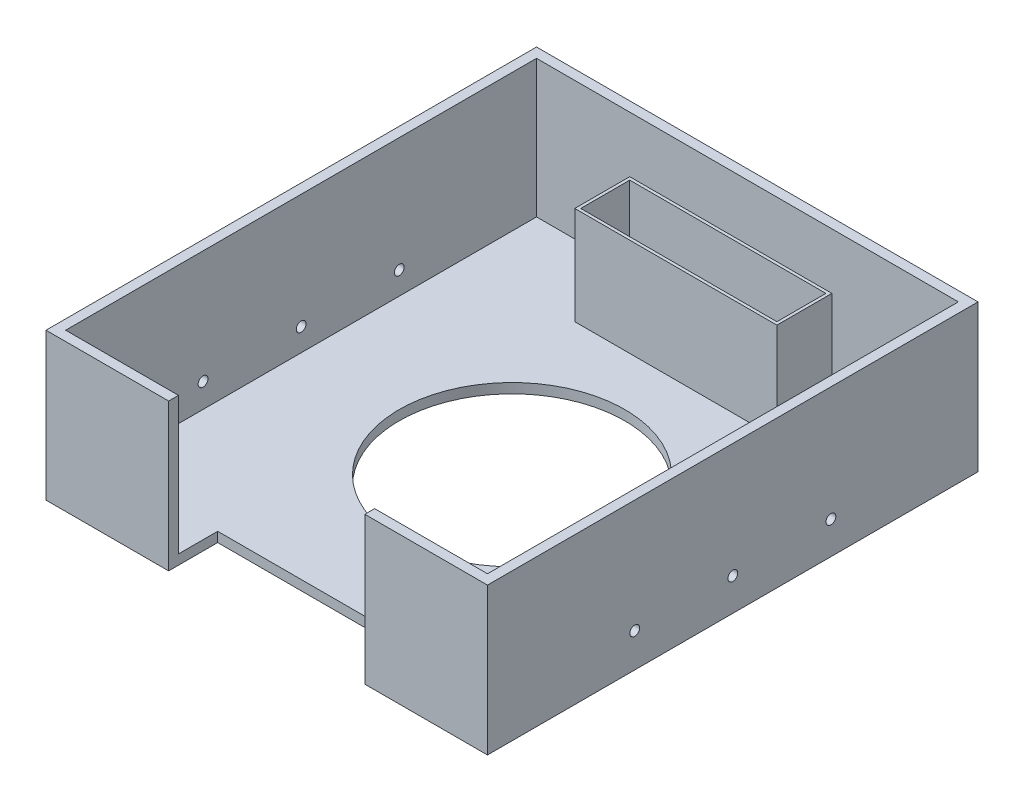
ISO-10303-21;
HEADER;
FILE_DESCRIPTION(('STEP AP214'),'2;1');
FILE_NAME('part.step','',(''),(''),'','','');
FILE_SCHEMA(('AUTOMOTIVE_DESIGN { 1 0 10303 214 1 1 1 1 }'));
ENDSEC;
DATA;
#1=APPLICATION_CONTEXT('core data for automotive mechanical design processes');
#2=APPLICATION_PROTOCOL_DEFINITION('international standard','automotive_design',2000,#1);
#3=PRODUCT_CONTEXT('',#1,'mechanical');
#4=PRODUCT('Part','Part','',(#3));
#5=PRODUCT_RELATED_PRODUCT_CATEGORY('part','',(#4));
#6=PRODUCT_DEFINITION_FORMATION('','',#4);
#7=PRODUCT_DEFINITION_CONTEXT('part definition',#1,'design');
#8=PRODUCT_DEFINITION('design','',#6,#7);
#9=PRODUCT_DEFINITION_SHAPE('','',#8);
#10=(LENGTH_UNIT() NAMED_UNIT(*) SI_UNIT(.MILLI.,.METRE.));
#11=(NAMED_UNIT(*) PLANE_ANGLE_UNIT() SI_UNIT($,.RADIAN.));
#12=(NAMED_UNIT(*) SI_UNIT($,.STERADIAN.) SOLID_ANGLE_UNIT());
#13=UNCERTAINTY_MEASURE_WITH_UNIT(LENGTH_MEASURE(1.E-05),#10,'distance_accuracy_value','');
#14=(GEOMETRIC_REPRESENTATION_CONTEXT(3) GLOBAL_UNCERTAINTY_ASSIGNED_CONTEXT((#13)) GLOBAL_UNIT_ASSIGNED_CONTEXT((#10,
#11,#12)) REPRESENTATION_CONTEXT('',''));
#15=CARTESIAN_POINT('',(0.,0.,0.));
#16=DIRECTION('',(0.,0.,1.));
#17=DIRECTION('',(1.,0.,0.));
#18=AXIS2_PLACEMENT_3D('',#15,#16,#17);
#19=CARTESIAN_POINT('',(0.,10.,0.));
#20=DIRECTION('',(0.,-1.,0.));
#21=DIRECTION('',(0.,0.,-1.));
#22=AXIS2_PLACEMENT_3D('',#19,#20,#21);
#23=PLANE('',#22);
#24=CARTESIAN_POINT('',(0.,10.,0.));
#25=DIRECTION('',(0.,1.,0.));
#26=DIRECTION('',(0.,0.,1.));
#27=AXIS2_PLACEMENT_3D('',#24,#25,#26);
#28=CIRCLE('',#27,115.);
#29=CARTESIAN_POINT('',(0.,10.,115.));
#30=VERTEX_POINT('',#29);
#31=EDGE_CURVE('E316',#30,#30,#28,.T.);
#32=ORIENTED_EDGE('',*,*,#31,.F.);
#33=EDGE_LOOP('',(#32));
#34=FACE_BOUND('',#33,.T.);
#35=DIRECTION('',(1.,0.,0.));
#36=VECTOR('',#35,1.);
#37=CARTESIAN_POINT('',(0.,10.,200.));
#38=LINE('',#37,#36);
#39=CARTESIAN_POINT('',(-100.,10.,200.));
#40=VERTEX_POINT('',#39);
#41=CARTESIAN_POINT('',(100.,10.,200.));
#42=VERTEX_POINT('',#41);
#43=EDGE_CURVE('E391',#40,#42,#38,.T.);
#44=ORIENTED_EDGE('',*,*,#43,.T.);
#45=DIRECTION('',(0.,0.,1.));
#46=VECTOR('',#45,1.);
#47=CARTESIAN_POINT('',(100.,10.,0.));
#48=LINE('',#47,#46);
#49=CARTESIAN_POINT('',(100.,10.,240.));
#50=VERTEX_POINT('',#49);
#51=EDGE_CURVE('E11',#42,#50,#48,.T.);
#52=ORIENTED_EDGE('',*,*,#51,.T.);
#53=DIRECTION('',(1.,0.,0.));
#54=VECTOR('',#53,1.);
#55=CARTESIAN_POINT('',(-215.,10.,240.));
#56=LINE('',#55,#54);
#57=CARTESIAN_POINT('',(215.,10.,240.));
#58=VERTEX_POINT('',#57);
#59=EDGE_CURVE('E320',#50,#58,#56,.T.);
#60=ORIENTED_EDGE('',*,*,#59,.T.);
#61=DIRECTION('',(0.,0.,-1.));
#62=VECTOR('',#61,1.);
#63=CARTESIAN_POINT('',(215.,10.,240.));
#64=LINE('',#63,#62);
#65=CARTESIAN_POINT('',(215.,10.,-240.));
#66=VERTEX_POINT('',#65);
#67=EDGE_CURVE('E338',#58,#66,#64,.T.);
#68=ORIENTED_EDGE('',*,*,#67,.T.);
#69=DIRECTION('',(-1.,0.,0.));
#70=VECTOR('',#69,1.);
#71=CARTESIAN_POINT('',(215.,10.,-240.));
#72=LINE('',#71,#70);
#73=CARTESIAN_POINT('',(-215.,10.,-240.));
#74=VERTEX_POINT('',#73);
#75=EDGE_CURVE('E341',#66,#74,#72,.T.);
#76=ORIENTED_EDGE('',*,*,#75,.T.);
#77=DIRECTION('',(0.,0.,1.));
#78=VECTOR('',#77,1.);
#79=CARTESIAN_POINT('',(-215.,10.,-240.));
#80=LINE('',#79,#78);
#81=CARTESIAN_POINT('',(-215.,10.,240.));
#82=VERTEX_POINT('',#81);
#83=EDGE_CURVE('E344',#74,#82,#80,.T.);
#84=ORIENTED_EDGE('',*,*,#83,.T.);
#85=CARTESIAN_POINT('',(-100.,10.,240.));
#86=VERTEX_POINT('',#85);
#87=EDGE_CURVE('E335',#82,#86,#56,.T.);
#88=ORIENTED_EDGE('',*,*,#87,.T.);
#89=DIRECTION('',(0.,0.,-1.));
#90=VECTOR('',#89,1.);
#91=CARTESIAN_POINT('',(-100.,10.,0.));
#92=LINE('',#91,#90);
#93=EDGE_CURVE('E43',#86,#40,#92,.T.);
#94=ORIENTED_EDGE('',*,*,#93,.T.);
#95=EDGE_LOOP('',(#44,#52,#60,#68,#76,#84,#88,#94));
#96=FACE_BOUND('',#95,.T.);
#97=DIRECTION('',(0.,0.,1.));
#98=VECTOR('',#97,1.);
#99=CARTESIAN_POINT('',(-103.,10.,-223.));
#100=LINE('',#99,#98);
#101=CARTESIAN_POINT('',(-103.,10.,-223.));
#102=VERTEX_POINT('',#101);
#103=CARTESIAN_POINT('',(-103.,10.,-167.));
#104=VERTEX_POINT('',#103);
#105=EDGE_CURVE('E201',#102,#104,#100,.T.);
#106=ORIENTED_EDGE('',*,*,#105,.F.);
#107=DIRECTION('',(-1.,0.,0.));
#108=VECTOR('',#107,1.);
#109=CARTESIAN_POINT('',(-103.,10.,-223.));
#110=LINE('',#109,#108);
#111=CARTESIAN_POINT('',(103.,10.,-223.));
#112=VERTEX_POINT('',#111);
#113=EDGE_CURVE('E229',#112,#102,#110,.T.);
#114=ORIENTED_EDGE('',*,*,#113,.F.);
#115=DIRECTION('',(0.,0.,-1.));
#116=VECTOR('',#115,1.);
#117=CARTESIAN_POINT('',(103.,10.,-223.));
#118=LINE('',#117,#116);
#119=CARTESIAN_POINT('',(103.,10.,-167.));
#120=VERTEX_POINT('',#119);
#121=EDGE_CURVE('E55',#120,#112,#118,.T.);
#122=ORIENTED_EDGE('',*,*,#121,.F.);
#123=DIRECTION('',(1.,0.,0.));
#124=VECTOR('',#123,1.);
#125=CARTESIAN_POINT('',(-103.,10.,-167.));
#126=LINE('',#125,#124);
#127=EDGE_CURVE('E50',#104,#120,#126,.T.);
#128=ORIENTED_EDGE('',*,*,#127,.F.);
#129=EDGE_LOOP('',(#106,#114,#122,#128));
#130=FACE_BOUND('',#129,.T.);
#131=ADVANCED_FACE('F35',(#34,#96,#130),#23,.F.);
#132=CARTESIAN_POINT('',(-225.,10.,250.));
#133=DIRECTION('',(0.,0.,-1.));
#134=DIRECTION('',(-1.,0.,0.));
#135=AXIS2_PLACEMENT_3D('',#132,#133,#134);
#136=PLANE('',#135);
#137=DIRECTION('',(1.,0.,0.));
#138=VECTOR('',#137,1.);
#139=CARTESIAN_POINT('',(-225.,150.,250.));
#140=LINE('',#139,#138);
#141=CARTESIAN_POINT('',(100.,150.,250.));
#142=VERTEX_POINT('',#141);
#143=CARTESIAN_POINT('',(225.,150.,250.));
#144=VERTEX_POINT('',#143);
#145=EDGE_CURVE('E355',#142,#144,#140,.T.);
#146=ORIENTED_EDGE('',*,*,#145,.F.);
#147=DIRECTION('',(0.,-1.,0.));
#148=VECTOR('',#147,1.);
#149=CARTESIAN_POINT('',(99.9999999999999,10.,250.));
#150=LINE('',#149,#148);
#151=CARTESIAN_POINT('',(100.,0.,250.));
#152=VERTEX_POINT('',#151);
#153=EDGE_CURVE('E313',#142,#152,#150,.T.);
#154=ORIENTED_EDGE('',*,*,#153,.T.);
#155=DIRECTION('',(1.,0.,0.));
#156=VECTOR('',#155,1.);
#157=CARTESIAN_POINT('',(-225.,0.,250.));
#158=LINE('',#157,#156);
#159=CARTESIAN_POINT('',(225.,0.,250.));
#160=VERTEX_POINT('',#159);
#161=EDGE_CURVE('E375',#152,#160,#158,.T.);
#162=ORIENTED_EDGE('',*,*,#161,.T.);
#163=DIRECTION('',(0.,-1.,0.));
#164=VECTOR('',#163,1.);
#165=CARTESIAN_POINT('',(225.,10.,250.));
#166=LINE('',#165,#164);
#167=EDGE_CURVE('E379',#144,#160,#166,.T.);
#168=ORIENTED_EDGE('',*,*,#167,.F.);
#169=EDGE_LOOP('',(#146,#154,#162,#168));
#170=FACE_BOUND('',#169,.T.);
#171=ADVANCED_FACE('F455',(#170),#136,.F.);
#172=CARTESIAN_POINT('',(-215.,150.,240.));
#173=DIRECTION('',(0.,0.,-1.));
#174=DIRECTION('',(-1.,0.,0.));
#175=AXIS2_PLACEMENT_3D('',#172,#173,#174);
#176=PLANE('',#175);
#177=DIRECTION('',(0.,-1.,0.));
#178=VECTOR('',#177,1.);
#179=CARTESIAN_POINT('',(99.9999999999999,150.,240.));
#180=LINE('',#179,#178);
#181=CARTESIAN_POINT('',(100.,150.,240.));
#182=VERTEX_POINT('',#181);
#183=EDGE_CURVE('E311',#182,#50,#180,.T.);
#184=ORIENTED_EDGE('',*,*,#183,.F.);
#185=DIRECTION('',(1.,0.,0.));
#186=VECTOR('',#185,1.);
#187=CARTESIAN_POINT('',(-215.,150.,240.));
#188=LINE('',#187,#186);
#189=CARTESIAN_POINT('',(215.,150.,240.));
#190=VERTEX_POINT('',#189);
#191=EDGE_CURVE('E327',#182,#190,#188,.T.);
#192=ORIENTED_EDGE('',*,*,#191,.T.);
#193=DIRECTION('',(0.,-1.,0.));
#194=VECTOR('',#193,1.);
#195=CARTESIAN_POINT('',(215.,150.,240.));
#196=LINE('',#195,#194);
#197=EDGE_CURVE('E352',#190,#58,#196,.T.);
#198=ORIENTED_EDGE('',*,*,#197,.T.);
#199=ORIENTED_EDGE('',*,*,#59,.F.);
#200=EDGE_LOOP('',(#184,#192,#198,#199));
#201=FACE_BOUND('',#200,.T.);
#202=ADVANCED_FACE('F429',(#201),#176,.T.);
#203=CARTESIAN_POINT('',(225.,10.,250.));
#204=DIRECTION('',(-1.,0.,0.));
#205=DIRECTION('',(0.,0.,1.));
#206=AXIS2_PLACEMENT_3D('',#203,#204,#205);
#207=PLANE('',#206);
#208=CARTESIAN_POINT('',(225.,34.7,99.9));
#209=DIRECTION('',(1.,0.,0.));
#210=DIRECTION('',(0.,0.,-1.));
#211=AXIS2_PLACEMENT_3D('',#208,#209,#210);
#212=CIRCLE('',#211,5.00000000000001);
#213=CARTESIAN_POINT('',(225.,34.7,94.9));
#214=VERTEX_POINT('',#213);
#215=EDGE_CURVE('E275',#214,#214,#212,.T.);
#216=ORIENTED_EDGE('',*,*,#215,.F.);
#217=EDGE_LOOP('',(#216));
#218=FACE_BOUND('',#217,.T.);
#219=CARTESIAN_POINT('',(225.,33.13,-0.100000000000017));
#220=DIRECTION('',(1.,0.,0.));
#221=DIRECTION('',(0.,0.,-1.));
#222=AXIS2_PLACEMENT_3D('',#219,#220,#221);
#223=CIRCLE('',#222,5.);
#224=CARTESIAN_POINT('',(225.,33.13,-5.10000000000002));
#225=VERTEX_POINT('',#224);
#226=EDGE_CURVE('E281',#225,#225,#223,.T.);
#227=ORIENTED_EDGE('',*,*,#226,.F.);
#228=EDGE_LOOP('',(#227));
#229=FACE_BOUND('',#228,.T.);
#230=CARTESIAN_POINT('',(225.,33.13,-100.1));
#231=DIRECTION('',(1.,0.,0.));
#232=DIRECTION('',(0.,0.,-1.));
#233=AXIS2_PLACEMENT_3D('',#230,#231,#232);
#234=CIRCLE('',#233,5.00000000000001);
#235=CARTESIAN_POINT('',(225.,33.13,-105.1));
#236=VERTEX_POINT('',#235);
#237=EDGE_CURVE('E268',#236,#236,#234,.T.);
#238=ORIENTED_EDGE('',*,*,#237,.F.);
#239=EDGE_LOOP('',(#238));
#240=FACE_BOUND('',#239,.T.);
#241=DIRECTION('',(0.,0.,-1.));
#242=VECTOR('',#241,1.);
#243=CARTESIAN_POINT('',(225.,0.,250.));
#244=LINE('',#243,#242);
#245=CARTESIAN_POINT('',(225.,0.,-250.));
#246=VERTEX_POINT('',#245);
#247=EDGE_CURVE('E368',#160,#246,#244,.T.);
#248=ORIENTED_EDGE('',*,*,#247,.T.);
#249=DIRECTION('',(0.,-1.,0.));
#250=VECTOR('',#249,1.);
#251=CARTESIAN_POINT('',(225.,10.,-250.));
#252=LINE('',#251,#250);
#253=CARTESIAN_POINT('',(225.,150.,-250.));
#254=VERTEX_POINT('',#253);
#255=EDGE_CURVE('E388',#254,#246,#252,.T.);
#256=ORIENTED_EDGE('',*,*,#255,.F.);
#257=DIRECTION('',(0.,0.,-1.));
#258=VECTOR('',#257,1.);
#259=CARTESIAN_POINT('',(225.,150.,250.));
#260=LINE('',#259,#258);
#261=EDGE_CURVE('E359',#144,#254,#260,.T.);
#262=ORIENTED_EDGE('',*,*,#261,.F.);
#263=ORIENTED_EDGE('',*,*,#167,.T.);
#264=EDGE_LOOP('',(#248,#256,#262,#263));
#265=FACE_BOUND('',#264,.T.);
#266=ADVANCED_FACE('F37',(#218,#229,#240,#265),#207,.F.);
#267=CARTESIAN_POINT('',(-225.,10.,-250.));
#268=DIRECTION('',(0.,0.,1.));
#269=DIRECTION('',(1.,0.,0.));
#270=AXIS2_PLACEMENT_3D('',#267,#268,#269);
#271=PLANE('',#270);
#272=DIRECTION('',(-1.,0.,0.));
#273=VECTOR('',#272,1.);
#274=CARTESIAN_POINT('',(-225.,0.,-250.));
#275=LINE('',#274,#273);
#276=CARTESIAN_POINT('',(-225.,0.,-250.));
#277=VERTEX_POINT('',#276);
#278=EDGE_CURVE('E371',#246,#277,#275,.T.);
#279=ORIENTED_EDGE('',*,*,#278,.T.);
#280=DIRECTION('',(0.,-1.,0.));
#281=VECTOR('',#280,1.);
#282=CARTESIAN_POINT('',(-225.,10.,-250.));
#283=LINE('',#282,#281);
#284=CARTESIAN_POINT('',(-225.,150.,-250.));
#285=VERTEX_POINT('',#284);
#286=EDGE_CURVE('E385',#285,#277,#283,.T.);
#287=ORIENTED_EDGE('',*,*,#286,.F.);
#288=DIRECTION('',(-1.,0.,0.));
#289=VECTOR('',#288,1.);
#290=CARTESIAN_POINT('',(225.,150.,-250.));
#291=LINE('',#290,#289);
#292=EDGE_CURVE('E362',#254,#285,#291,.T.);
#293=ORIENTED_EDGE('',*,*,#292,.F.);
#294=ORIENTED_EDGE('',*,*,#255,.T.);
#295=EDGE_LOOP('',(#279,#287,#293,#294));
#296=FACE_BOUND('',#295,.T.);
#297=ADVANCED_FACE('F641',(#296),#271,.F.);
#298=CARTESIAN_POINT('',(-225.,10.,250.));
#299=DIRECTION('',(1.,0.,0.));
#300=DIRECTION('',(0.,0.,-1.));
#301=AXIS2_PLACEMENT_3D('',#298,#299,#300);
#302=PLANE('',#301);
#303=CARTESIAN_POINT('',(-225.,33.13,-100.1));
#304=DIRECTION('',(-1.,0.,0.));
#305=DIRECTION('',(0.,0.,1.));
#306=AXIS2_PLACEMENT_3D('',#303,#304,#305);
#307=CIRCLE('',#306,5.00000000000001);
#308=CARTESIAN_POINT('',(-225.,33.13,-95.1));
#309=VERTEX_POINT('',#308);
#310=EDGE_CURVE('E252',#309,#309,#307,.T.);
#311=ORIENTED_EDGE('',*,*,#310,.F.);
#312=EDGE_LOOP('',(#311));
#313=FACE_BOUND('',#312,.T.);
#314=CARTESIAN_POINT('',(-225.,34.7,99.9));
#315=DIRECTION('',(-1.,0.,0.));
#316=DIRECTION('',(0.,0.,1.));
#317=AXIS2_PLACEMENT_3D('',#314,#315,#316);
#318=CIRCLE('',#317,5.00000000000001);
#319=CARTESIAN_POINT('',(-225.,34.7,104.9));
#320=VERTEX_POINT('',#319);
#321=EDGE_CURVE('E257',#320,#320,#318,.T.);
#322=ORIENTED_EDGE('',*,*,#321,.F.);
#323=EDGE_LOOP('',(#322));
#324=FACE_BOUND('',#323,.T.);
#325=CARTESIAN_POINT('',(-225.,33.13,-0.100000000000017));
#326=DIRECTION('',(-1.,0.,0.));
#327=DIRECTION('',(0.,0.,1.));
#328=AXIS2_PLACEMENT_3D('',#325,#326,#327);
#329=CIRCLE('',#328,5.00000000000001);
#330=CARTESIAN_POINT('',(-225.,33.13,4.89999999999999));
#331=VERTEX_POINT('',#330);
#332=EDGE_CURVE('E256',#331,#331,#329,.T.);
#333=ORIENTED_EDGE('',*,*,#332,.F.);
#334=EDGE_LOOP('',(#333));
#335=FACE_BOUND('',#334,.T.);
#336=DIRECTION('',(0.,0.,1.));
#337=VECTOR('',#336,1.);
#338=CARTESIAN_POINT('',(-225.,0.,250.));
#339=LINE('',#338,#337);
#340=CARTESIAN_POINT('',(-225.,0.,250.));
#341=VERTEX_POINT('',#340);
#342=EDGE_CURVE('E373',#277,#341,#339,.T.);
#343=ORIENTED_EDGE('',*,*,#342,.T.);
#344=DIRECTION('',(0.,-1.,0.));
#345=VECTOR('',#344,1.);
#346=CARTESIAN_POINT('',(-225.,10.,250.));
#347=LINE('',#346,#345);
#348=CARTESIAN_POINT('',(-225.,150.,250.));
#349=VERTEX_POINT('',#348);
#350=EDGE_CURVE('E382',#349,#341,#347,.T.);
#351=ORIENTED_EDGE('',*,*,#350,.F.);
#352=DIRECTION('',(0.,0.,1.));
#353=VECTOR('',#352,1.);
#354=CARTESIAN_POINT('',(-225.,150.,-250.));
#355=LINE('',#354,#353);
#356=EDGE_CURVE('E365',#285,#349,#355,.T.);
#357=ORIENTED_EDGE('',*,*,#356,.F.);
#358=ORIENTED_EDGE('',*,*,#286,.T.);
#359=EDGE_LOOP('',(#343,#351,#357,#358));
#360=FACE_BOUND('',#359,.T.);
#361=ADVANCED_FACE('F652',(#313,#324,#335,#360),#302,.F.);
#362=CARTESIAN_POINT('',(-100.,0.,250.));
#363=VERTEX_POINT('',#362);
#364=EDGE_CURVE('E376',#341,#363,#158,.T.);
#365=ORIENTED_EDGE('',*,*,#364,.T.);
#366=DIRECTION('',(0.,1.,0.));
#367=VECTOR('',#366,1.);
#368=CARTESIAN_POINT('',(-100.,10.,250.));
#369=LINE('',#368,#367);
#370=CARTESIAN_POINT('',(-100.,150.,250.));
#371=VERTEX_POINT('',#370);
#372=EDGE_CURVE('E308',#363,#371,#369,.T.);
#373=ORIENTED_EDGE('',*,*,#372,.T.);
#374=EDGE_CURVE('E356',#349,#371,#140,.T.);
#375=ORIENTED_EDGE('',*,*,#374,.F.);
#376=ORIENTED_EDGE('',*,*,#350,.T.);
#377=EDGE_LOOP('',(#365,#373,#375,#376));
#378=FACE_BOUND('',#377,.T.);
#379=ADVANCED_FACE('F412',(#378),#136,.F.);
#380=CARTESIAN_POINT('',(0.,0.,0.));
#381=DIRECTION('',(0.,-1.,0.));
#382=DIRECTION('',(0.,0.,-1.));
#383=AXIS2_PLACEMENT_3D('',#380,#381,#382);
#384=PLANE('',#383);
#385=DIRECTION('',(0.,0.,-1.));
#386=VECTOR('',#385,1.);
#387=CARTESIAN_POINT('',(100.,0.,300.));
#388=LINE('',#387,#386);
#389=CARTESIAN_POINT('',(100.,0.,200.));
#390=VERTEX_POINT('',#389);
#391=EDGE_CURVE('E289',#152,#390,#388,.T.);
#392=ORIENTED_EDGE('',*,*,#391,.T.);
#393=DIRECTION('',(-1.,0.,0.));
#394=VECTOR('',#393,1.);
#395=CARTESIAN_POINT('',(-100.,0.,200.));
#396=LINE('',#395,#394);
#397=CARTESIAN_POINT('',(-100.,0.,200.));
#398=VERTEX_POINT('',#397);
#399=EDGE_CURVE('E292',#390,#398,#396,.T.);
#400=ORIENTED_EDGE('',*,*,#399,.T.);
#401=DIRECTION('',(0.,0.,1.));
#402=VECTOR('',#401,1.);
#403=CARTESIAN_POINT('',(-100.,0.,300.));
#404=LINE('',#403,#402);
#405=EDGE_CURVE('E296',#398,#363,#404,.T.);
#406=ORIENTED_EDGE('',*,*,#405,.T.);
#407=ORIENTED_EDGE('',*,*,#364,.F.);
#408=ORIENTED_EDGE('',*,*,#342,.F.);
#409=ORIENTED_EDGE('',*,*,#278,.F.);
#410=ORIENTED_EDGE('',*,*,#247,.F.);
#411=ORIENTED_EDGE('',*,*,#161,.F.);
#412=EDGE_LOOP('',(#392,#400,#406,#407,#408,#409,#410,#411));
#413=FACE_BOUND('',#412,.T.);
#414=CARTESIAN_POINT('',(0.,0.,0.));
#415=DIRECTION('',(0.,1.,0.));
#416=DIRECTION('',(0.,0.,1.));
#417=AXIS2_PLACEMENT_3D('',#414,#415,#416);
#418=CIRCLE('',#417,115.);
#419=CARTESIAN_POINT('',(0.,0.,115.));
#420=VERTEX_POINT('',#419);
#421=EDGE_CURVE('E317',#420,#420,#418,.T.);
#422=ORIENTED_EDGE('',*,*,#421,.T.);
#423=EDGE_LOOP('',(#422));
#424=FACE_BOUND('',#423,.T.);
#425=ADVANCED_FACE('F416',(#413,#424),#384,.T.);
#426=CARTESIAN_POINT('',(0.,150.,0.));
#427=DIRECTION('',(0.,1.,0.));
#428=DIRECTION('',(0.,0.,1.));
#429=AXIS2_PLACEMENT_3D('',#426,#427,#428);
#430=PLANE('',#429);
#431=DIRECTION('',(0.,0.,-1.));
#432=VECTOR('',#431,1.);
#433=CARTESIAN_POINT('',(100.,150.,300.));
#434=LINE('',#433,#432);
#435=EDGE_CURVE('E274',#142,#182,#434,.T.);
#436=ORIENTED_EDGE('',*,*,#435,.F.);
#437=ORIENTED_EDGE('',*,*,#145,.T.);
#438=ORIENTED_EDGE('',*,*,#261,.T.);
#439=ORIENTED_EDGE('',*,*,#292,.T.);
#440=ORIENTED_EDGE('',*,*,#356,.T.);
#441=ORIENTED_EDGE('',*,*,#374,.T.);
#442=DIRECTION('',(0.,0.,1.));
#443=VECTOR('',#442,1.);
#444=CARTESIAN_POINT('',(-100.,150.,300.));
#445=LINE('',#444,#443);
#446=CARTESIAN_POINT('',(-100.,150.,240.));
#447=VERTEX_POINT('',#446);
#448=EDGE_CURVE('E293',#447,#371,#445,.T.);
#449=ORIENTED_EDGE('',*,*,#448,.F.);
#450=CARTESIAN_POINT('',(-215.,150.,240.));
#451=VERTEX_POINT('',#450);
#452=EDGE_CURVE('E323',#451,#447,#188,.T.);
#453=ORIENTED_EDGE('',*,*,#452,.F.);
#454=DIRECTION('',(0.,0.,1.));
#455=VECTOR('',#454,1.);
#456=CARTESIAN_POINT('',(-215.,150.,-240.));
#457=LINE('',#456,#455);
#458=CARTESIAN_POINT('',(-215.,150.,-240.));
#459=VERTEX_POINT('',#458);
#460=EDGE_CURVE('E332',#459,#451,#457,.T.);
#461=ORIENTED_EDGE('',*,*,#460,.F.);
#462=DIRECTION('',(-1.,0.,0.));
#463=VECTOR('',#462,1.);
#464=CARTESIAN_POINT('',(215.,150.,-240.));
#465=LINE('',#464,#463);
#466=CARTESIAN_POINT('',(215.,150.,-240.));
#467=VERTEX_POINT('',#466);
#468=EDGE_CURVE('E329',#467,#459,#465,.T.);
#469=ORIENTED_EDGE('',*,*,#468,.F.);
#470=DIRECTION('',(0.,0.,-1.));
#471=VECTOR('',#470,1.);
#472=CARTESIAN_POINT('',(215.,150.,240.));
#473=LINE('',#472,#471);
#474=EDGE_CURVE('E326',#190,#467,#473,.T.);
#475=ORIENTED_EDGE('',*,*,#474,.F.);
#476=ORIENTED_EDGE('',*,*,#191,.F.);
#477=EDGE_LOOP('',(#436,#437,#438,#439,#440,#441,#449,#453,#461,#469,#475,#476));
#478=FACE_BOUND('',#477,.T.);
#479=ADVANCED_FACE('F408',(#478),#430,.T.);
#480=DIRECTION('',(0.,1.,0.));
#481=VECTOR('',#480,1.);
#482=CARTESIAN_POINT('',(-100.,150.,240.));
#483=LINE('',#482,#481);
#484=EDGE_CURVE('E305',#86,#447,#483,.T.);
#485=ORIENTED_EDGE('',*,*,#484,.F.);
#486=ORIENTED_EDGE('',*,*,#87,.F.);
#487=DIRECTION('',(0.,-1.,0.));
#488=VECTOR('',#487,1.);
#489=CARTESIAN_POINT('',(-215.,150.,240.));
#490=LINE('',#489,#488);
#491=EDGE_CURVE('E334',#451,#82,#490,.T.);
#492=ORIENTED_EDGE('',*,*,#491,.F.);
#493=ORIENTED_EDGE('',*,*,#452,.T.);
#494=EDGE_LOOP('',(#485,#486,#492,#493));
#495=FACE_BOUND('',#494,.T.);
#496=ADVANCED_FACE('F402',(#495),#176,.T.);
#497=CARTESIAN_POINT('',(215.,150.,240.));
#498=DIRECTION('',(-1.,0.,0.));
#499=DIRECTION('',(0.,0.,1.));
#500=AXIS2_PLACEMENT_3D('',#497,#498,#499);
#501=PLANE('',#500);
#502=CARTESIAN_POINT('',(215.,34.7,99.9));
#503=DIRECTION('',(1.,0.,0.));
#504=DIRECTION('',(0.,0.,-1.));
#505=AXIS2_PLACEMENT_3D('',#502,#503,#504);
#506=CIRCLE('',#505,5.00000000000001);
#507=CARTESIAN_POINT('',(215.,34.7,94.9));
#508=VERTEX_POINT('',#507);
#509=EDGE_CURVE('E271',#508,#508,#506,.T.);
#510=ORIENTED_EDGE('',*,*,#509,.T.);
#511=EDGE_LOOP('',(#510));
#512=FACE_BOUND('',#511,.T.);
#513=CARTESIAN_POINT('',(215.,33.13,-0.100000000000017));
#514=DIRECTION('',(1.,0.,0.));
#515=DIRECTION('',(0.,0.,-1.));
#516=AXIS2_PLACEMENT_3D('',#513,#514,#515);
#517=CIRCLE('',#516,5.);
#518=CARTESIAN_POINT('',(215.,33.13,-5.10000000000002));
#519=VERTEX_POINT('',#518);
#520=EDGE_CURVE('E278',#519,#519,#517,.T.);
#521=ORIENTED_EDGE('',*,*,#520,.T.);
#522=EDGE_LOOP('',(#521));
#523=FACE_BOUND('',#522,.T.);
#524=CARTESIAN_POINT('',(215.,33.13,-100.1));
#525=DIRECTION('',(1.,0.,0.));
#526=DIRECTION('',(0.,0.,-1.));
#527=AXIS2_PLACEMENT_3D('',#524,#525,#526);
#528=CIRCLE('',#527,5.00000000000001);
#529=CARTESIAN_POINT('',(215.,33.13,-105.1));
#530=VERTEX_POINT('',#529);
#531=EDGE_CURVE('E284',#530,#530,#528,.T.);
#532=ORIENTED_EDGE('',*,*,#531,.T.);
#533=EDGE_LOOP('',(#532));
#534=FACE_BOUND('',#533,.T.);
#535=ORIENTED_EDGE('',*,*,#67,.F.);
#536=ORIENTED_EDGE('',*,*,#197,.F.);
#537=ORIENTED_EDGE('',*,*,#474,.T.);
#538=DIRECTION('',(0.,-1.,0.));
#539=VECTOR('',#538,1.);
#540=CARTESIAN_POINT('',(215.,150.,-240.));
#541=LINE('',#540,#539);
#542=EDGE_CURVE('E350',#467,#66,#541,.T.);
#543=ORIENTED_EDGE('',*,*,#542,.T.);
#544=EDGE_LOOP('',(#535,#536,#537,#543));
#545=FACE_BOUND('',#544,.T.);
#546=ADVANCED_FACE('F434',(#512,#523,#534,#545),#501,.T.);
#547=CARTESIAN_POINT('',(215.,150.,-240.));
#548=DIRECTION('',(0.,0.,1.));
#549=DIRECTION('',(1.,0.,0.));
#550=AXIS2_PLACEMENT_3D('',#547,#548,#549);
#551=PLANE('',#550);
#552=ORIENTED_EDGE('',*,*,#75,.F.);
#553=ORIENTED_EDGE('',*,*,#542,.F.);
#554=ORIENTED_EDGE('',*,*,#468,.T.);
#555=DIRECTION('',(0.,-1.,0.));
#556=VECTOR('',#555,1.);
#557=CARTESIAN_POINT('',(-215.,150.,-240.));
#558=LINE('',#557,#556);
#559=EDGE_CURVE('E348',#459,#74,#558,.T.);
#560=ORIENTED_EDGE('',*,*,#559,.T.);
#561=EDGE_LOOP('',(#552,#553,#554,#560));
#562=FACE_BOUND('',#561,.T.);
#563=ADVANCED_FACE('F438',(#562),#551,.T.);
#564=CARTESIAN_POINT('',(-215.,150.,-240.));
#565=DIRECTION('',(1.,0.,0.));
#566=DIRECTION('',(0.,0.,-1.));
#567=AXIS2_PLACEMENT_3D('',#564,#565,#566);
#568=PLANE('',#567);
#569=CARTESIAN_POINT('',(-215.,33.13,-100.1));
#570=DIRECTION('',(-1.,0.,0.));
#571=DIRECTION('',(0.,0.,1.));
#572=AXIS2_PLACEMENT_3D('',#569,#570,#571);
#573=CIRCLE('',#572,5.00000000000001);
#574=CARTESIAN_POINT('',(-215.,33.13,-95.1));
#575=VERTEX_POINT('',#574);
#576=EDGE_CURVE('E260',#575,#575,#573,.T.);
#577=ORIENTED_EDGE('',*,*,#576,.T.);
#578=EDGE_LOOP('',(#577));
#579=FACE_BOUND('',#578,.T.);
#580=CARTESIAN_POINT('',(-215.,34.7,99.9));
#581=DIRECTION('',(-1.,0.,0.));
#582=DIRECTION('',(0.,0.,1.));
#583=AXIS2_PLACEMENT_3D('',#580,#581,#582);
#584=CIRCLE('',#583,5.00000000000001);
#585=CARTESIAN_POINT('',(-215.,34.7,104.9));
#586=VERTEX_POINT('',#585);
#587=EDGE_CURVE('E253',#586,#586,#584,.T.);
#588=ORIENTED_EDGE('',*,*,#587,.T.);
#589=EDGE_LOOP('',(#588));
#590=FACE_BOUND('',#589,.T.);
#591=CARTESIAN_POINT('',(-215.,33.13,-0.100000000000017));
#592=DIRECTION('',(-1.,0.,0.));
#593=DIRECTION('',(0.,0.,1.));
#594=AXIS2_PLACEMENT_3D('',#591,#592,#593);
#595=CIRCLE('',#594,5.00000000000001);
#596=CARTESIAN_POINT('',(-215.,33.13,4.89999999999999));
#597=VERTEX_POINT('',#596);
#598=EDGE_CURVE('E265',#597,#597,#595,.T.);
#599=ORIENTED_EDGE('',*,*,#598,.T.);
#600=EDGE_LOOP('',(#599));
#601=FACE_BOUND('',#600,.T.);
#602=ORIENTED_EDGE('',*,*,#83,.F.);
#603=ORIENTED_EDGE('',*,*,#559,.F.);
#604=ORIENTED_EDGE('',*,*,#460,.T.);
#605=ORIENTED_EDGE('',*,*,#491,.T.);
#606=EDGE_LOOP('',(#602,#603,#604,#605));
#607=FACE_BOUND('',#606,.T.);
#608=ADVANCED_FACE('F441',(#579,#590,#601,#607),#568,.T.);
#609=CARTESIAN_POINT('',(0.,0.,0.));
#610=DIRECTION('',(0.,1.,0.));
#611=DIRECTION('',(0.,0.,1.));
#612=AXIS2_PLACEMENT_3D('',#609,#610,#611);
#613=CYLINDRICAL_SURFACE('',#612,115.);
#614=ORIENTED_EDGE('',*,*,#421,.F.);
#615=EDGE_LOOP('',(#614));
#616=FACE_BOUND('',#615,.T.);
#617=ORIENTED_EDGE('',*,*,#31,.T.);
#618=EDGE_LOOP('',(#617));
#619=FACE_BOUND('',#618,.T.);
#620=ADVANCED_FACE('F443',(#616,#619),#613,.F.);
#621=CARTESIAN_POINT('',(100.,0.,300.));
#622=DIRECTION('',(1.,0.,0.));
#623=DIRECTION('',(0.,0.,-1.));
#624=AXIS2_PLACEMENT_3D('',#621,#622,#623);
#625=PLANE('',#624);
#626=ORIENTED_EDGE('',*,*,#435,.T.);
#627=ORIENTED_EDGE('',*,*,#183,.T.);
#628=ORIENTED_EDGE('',*,*,#51,.F.);
#629=DIRECTION('',(0.,1.,0.));
#630=VECTOR('',#629,1.);
#631=CARTESIAN_POINT('',(100.,0.,200.));
#632=LINE('',#631,#630);
#633=EDGE_CURVE('E299',#390,#42,#632,.T.);
#634=ORIENTED_EDGE('',*,*,#633,.F.);
#635=ORIENTED_EDGE('',*,*,#391,.F.);
#636=ORIENTED_EDGE('',*,*,#153,.F.);
#637=EDGE_LOOP('',(#626,#627,#628,#634,#635,#636));
#638=FACE_BOUND('',#637,.T.);
#639=ADVANCED_FACE('F424',(#638),#625,.F.);
#640=CARTESIAN_POINT('',(-100.,0.,300.));
#641=DIRECTION('',(-1.,0.,0.));
#642=DIRECTION('',(0.,0.,1.));
#643=AXIS2_PLACEMENT_3D('',#640,#641,#642);
#644=PLANE('',#643);
#645=ORIENTED_EDGE('',*,*,#405,.F.);
#646=DIRECTION('',(0.,1.,0.));
#647=VECTOR('',#646,1.);
#648=CARTESIAN_POINT('',(-100.,0.,200.));
#649=LINE('',#648,#647);
#650=EDGE_CURVE('E302',#398,#40,#649,.T.);
#651=ORIENTED_EDGE('',*,*,#650,.T.);
#652=ORIENTED_EDGE('',*,*,#93,.F.);
#653=ORIENTED_EDGE('',*,*,#484,.T.);
#654=ORIENTED_EDGE('',*,*,#448,.T.);
#655=ORIENTED_EDGE('',*,*,#372,.F.);
#656=EDGE_LOOP('',(#645,#651,#652,#653,#654,#655));
#657=FACE_BOUND('',#656,.T.);
#658=ADVANCED_FACE('F399',(#657),#644,.F.);
#659=CARTESIAN_POINT('',(-100.,0.,200.));
#660=DIRECTION('',(0.,0.,-1.));
#661=DIRECTION('',(-1.,0.,0.));
#662=AXIS2_PLACEMENT_3D('',#659,#660,#661);
#663=PLANE('',#662);
#664=ORIENTED_EDGE('',*,*,#650,.F.);
#665=ORIENTED_EDGE('',*,*,#399,.F.);
#666=ORIENTED_EDGE('',*,*,#633,.T.);
#667=ORIENTED_EDGE('',*,*,#43,.F.);
#668=EDGE_LOOP('',(#664,#665,#666,#667));
#669=FACE_BOUND('',#668,.T.);
#670=ADVANCED_FACE('F421',(#669),#663,.F.);
#671=CARTESIAN_POINT('',(215.,33.13,-100.1));
#672=DIRECTION('',(1.,0.,0.));
#673=DIRECTION('',(0.,0.,-1.));
#674=AXIS2_PLACEMENT_3D('',#671,#672,#673);
#675=CYLINDRICAL_SURFACE('',#674,5.00000000000001);
#676=ORIENTED_EDGE('',*,*,#531,.F.);
#677=EDGE_LOOP('',(#676));
#678=FACE_BOUND('',#677,.T.);
#679=ORIENTED_EDGE('',*,*,#237,.T.);
#680=EDGE_LOOP('',(#679));
#681=FACE_BOUND('',#680,.T.);
#682=ADVANCED_FACE('F526',(#678,#681),#675,.F.);
#683=CARTESIAN_POINT('',(215.,33.13,-0.100000000000017));
#684=DIRECTION('',(1.,0.,0.));
#685=DIRECTION('',(0.,0.,-1.));
#686=AXIS2_PLACEMENT_3D('',#683,#684,#685);
#687=CYLINDRICAL_SURFACE('',#686,5.);
#688=ORIENTED_EDGE('',*,*,#520,.F.);
#689=EDGE_LOOP('',(#688));
#690=FACE_BOUND('',#689,.T.);
#691=ORIENTED_EDGE('',*,*,#226,.T.);
#692=EDGE_LOOP('',(#691));
#693=FACE_BOUND('',#692,.T.);
#694=ADVANCED_FACE('F522',(#690,#693),#687,.F.);
#695=CARTESIAN_POINT('',(215.,34.7,99.9));
#696=DIRECTION('',(1.,0.,0.));
#697=DIRECTION('',(0.,0.,-1.));
#698=AXIS2_PLACEMENT_3D('',#695,#696,#697);
#699=CYLINDRICAL_SURFACE('',#698,5.00000000000001);
#700=ORIENTED_EDGE('',*,*,#509,.F.);
#701=EDGE_LOOP('',(#700));
#702=FACE_BOUND('',#701,.T.);
#703=ORIENTED_EDGE('',*,*,#215,.T.);
#704=EDGE_LOOP('',(#703));
#705=FACE_BOUND('',#704,.T.);
#706=ADVANCED_FACE('F518',(#702,#705),#699,.F.);
#707=CARTESIAN_POINT('',(-215.,33.13,-0.100000000000017));
#708=DIRECTION('',(-1.,0.,0.));
#709=DIRECTION('',(0.,0.,1.));
#710=AXIS2_PLACEMENT_3D('',#707,#708,#709);
#711=CYLINDRICAL_SURFACE('',#710,5.00000000000001);
#712=ORIENTED_EDGE('',*,*,#598,.F.);
#713=EDGE_LOOP('',(#712));
#714=FACE_BOUND('',#713,.T.);
#715=ORIENTED_EDGE('',*,*,#332,.T.);
#716=EDGE_LOOP('',(#715));
#717=FACE_BOUND('',#716,.T.);
#718=ADVANCED_FACE('F511',(#714,#717),#711,.F.);
#719=CARTESIAN_POINT('',(-215.,34.7,99.9));
#720=DIRECTION('',(-1.,0.,0.));
#721=DIRECTION('',(0.,0.,1.));
#722=AXIS2_PLACEMENT_3D('',#719,#720,#721);
#723=CYLINDRICAL_SURFACE('',#722,5.00000000000001);
#724=ORIENTED_EDGE('',*,*,#587,.F.);
#725=EDGE_LOOP('',(#724));
#726=FACE_BOUND('',#725,.T.);
#727=ORIENTED_EDGE('',*,*,#321,.T.);
#728=EDGE_LOOP('',(#727));
#729=FACE_BOUND('',#728,.T.);
#730=ADVANCED_FACE('F508',(#726,#729),#723,.F.);
#731=CARTESIAN_POINT('',(-215.,33.13,-100.1));
#732=DIRECTION('',(-1.,0.,0.));
#733=DIRECTION('',(0.,0.,1.));
#734=AXIS2_PLACEMENT_3D('',#731,#732,#733);
#735=CYLINDRICAL_SURFACE('',#734,5.00000000000001);
#736=ORIENTED_EDGE('',*,*,#576,.F.);
#737=EDGE_LOOP('',(#736));
#738=FACE_BOUND('',#737,.T.);
#739=ORIENTED_EDGE('',*,*,#310,.T.);
#740=EDGE_LOOP('',(#739));
#741=FACE_BOUND('',#740,.T.);
#742=ADVANCED_FACE('F492',(#738,#741),#735,.F.);
#743=CARTESIAN_POINT('',(0.,110.,0.));
#744=DIRECTION('',(0.,1.,0.));
#745=DIRECTION('',(0.,0.,1.));
#746=AXIS2_PLACEMENT_3D('',#743,#744,#745);
#747=PLANE('',#746);
#748=DIRECTION('',(0.,0.,1.));
#749=VECTOR('',#748,1.);
#750=CARTESIAN_POINT('',(-103.,110.,-223.));
#751=LINE('',#750,#749);
#752=CARTESIAN_POINT('',(-103.,110.,-223.));
#753=VERTEX_POINT('',#752);
#754=CARTESIAN_POINT('',(-103.,110.,-167.));
#755=VERTEX_POINT('',#754);
#756=EDGE_CURVE('E225',#753,#755,#751,.T.);
#757=ORIENTED_EDGE('',*,*,#756,.T.);
#758=DIRECTION('',(1.,0.,0.));
#759=VECTOR('',#758,1.);
#760=CARTESIAN_POINT('',(-103.,110.,-167.));
#761=LINE('',#760,#759);
#762=CARTESIAN_POINT('',(103.,110.,-167.));
#763=VERTEX_POINT('',#762);
#764=EDGE_CURVE('E228',#755,#763,#761,.T.);
#765=ORIENTED_EDGE('',*,*,#764,.T.);
#766=DIRECTION('',(0.,0.,-1.));
#767=VECTOR('',#766,1.);
#768=CARTESIAN_POINT('',(103.,110.,-223.));
#769=LINE('',#768,#767);
#770=CARTESIAN_POINT('',(103.,110.,-223.));
#771=VERTEX_POINT('',#770);
#772=EDGE_CURVE('E231',#763,#771,#769,.T.);
#773=ORIENTED_EDGE('',*,*,#772,.T.);
#774=DIRECTION('',(-1.,0.,0.));
#775=VECTOR('',#774,1.);
#776=CARTESIAN_POINT('',(-103.,110.,-223.));
#777=LINE('',#776,#775);
#778=EDGE_CURVE('E233',#771,#753,#777,.T.);
#779=ORIENTED_EDGE('',*,*,#778,.T.);
#780=EDGE_LOOP('',(#757,#765,#773,#779));
#781=FACE_BOUND('',#780,.T.);
#782=DIRECTION('',(1.,0.,0.));
#783=VECTOR('',#782,1.);
#784=CARTESIAN_POINT('',(-100.,110.,-170.));
#785=LINE('',#784,#783);
#786=CARTESIAN_POINT('',(-100.,110.,-170.));
#787=VERTEX_POINT('',#786);
#788=CARTESIAN_POINT('',(100.,110.,-170.));
#789=VERTEX_POINT('',#788);
#790=EDGE_CURVE('E193',#787,#789,#785,.T.);
#791=ORIENTED_EDGE('',*,*,#790,.F.);
#792=DIRECTION('',(0.,0.,1.));
#793=VECTOR('',#792,1.);
#794=CARTESIAN_POINT('',(-100.,110.,-220.));
#795=LINE('',#794,#793);
#796=CARTESIAN_POINT('',(-100.,110.,-220.));
#797=VERTEX_POINT('',#796);
#798=EDGE_CURVE('E183',#797,#787,#795,.T.);
#799=ORIENTED_EDGE('',*,*,#798,.F.);
#800=DIRECTION('',(-1.,0.,0.));
#801=VECTOR('',#800,1.);
#802=CARTESIAN_POINT('',(-100.,110.,-220.));
#803=LINE('',#802,#801);
#804=CARTESIAN_POINT('',(100.,110.,-220.));
#805=VERTEX_POINT('',#804);
#806=EDGE_CURVE('E209',#805,#797,#803,.T.);
#807=ORIENTED_EDGE('',*,*,#806,.F.);
#808=DIRECTION('',(0.,0.,-1.));
#809=VECTOR('',#808,1.);
#810=CARTESIAN_POINT('',(100.,110.,-220.));
#811=LINE('',#810,#809);
#812=EDGE_CURVE('E207',#789,#805,#811,.T.);
#813=ORIENTED_EDGE('',*,*,#812,.F.);
#814=EDGE_LOOP('',(#791,#799,#807,#813));
#815=FACE_BOUND('',#814,.T.);
#816=ADVANCED_FACE('F205',(#781,#815),#747,.T.);
#817=CARTESIAN_POINT('',(-103.,110.,-223.));
#818=DIRECTION('',(1.,0.,0.));
#819=DIRECTION('',(0.,0.,-1.));
#820=AXIS2_PLACEMENT_3D('',#817,#818,#819);
#821=PLANE('',#820);
#822=ORIENTED_EDGE('',*,*,#105,.T.);
#823=DIRECTION('',(0.,-1.,0.));
#824=VECTOR('',#823,1.);
#825=CARTESIAN_POINT('',(-103.,110.,-167.));
#826=LINE('',#825,#824);
#827=EDGE_CURVE('E250',#755,#104,#826,.T.);
#828=ORIENTED_EDGE('',*,*,#827,.F.);
#829=ORIENTED_EDGE('',*,*,#756,.F.);
#830=DIRECTION('',(0.,-1.,0.));
#831=VECTOR('',#830,1.);
#832=CARTESIAN_POINT('',(-103.,110.,-223.));
#833=LINE('',#832,#831);
#834=EDGE_CURVE('E235',#753,#102,#833,.T.);
#835=ORIENTED_EDGE('',*,*,#834,.T.);
#836=EDGE_LOOP('',(#822,#828,#829,#835));
#837=FACE_BOUND('',#836,.T.);
#838=ADVANCED_FACE('F491',(#837),#821,.F.);
#839=CARTESIAN_POINT('',(-103.,110.,-167.));
#840=DIRECTION('',(0.,0.,-1.));
#841=DIRECTION('',(-1.,0.,0.));
#842=AXIS2_PLACEMENT_3D('',#839,#840,#841);
#843=PLANE('',#842);
#844=ORIENTED_EDGE('',*,*,#127,.T.);
#845=DIRECTION('',(0.,-1.,0.));
#846=VECTOR('',#845,1.);
#847=CARTESIAN_POINT('',(103.,110.,-167.));
#848=LINE('',#847,#846);
#849=EDGE_CURVE('E247',#763,#120,#848,.T.);
#850=ORIENTED_EDGE('',*,*,#849,.F.);
#851=ORIENTED_EDGE('',*,*,#764,.F.);
#852=ORIENTED_EDGE('',*,*,#827,.T.);
#853=EDGE_LOOP('',(#844,#850,#851,#852));
#854=FACE_BOUND('',#853,.T.);
#855=ADVANCED_FACE('F500',(#854),#843,.F.);
#856=CARTESIAN_POINT('',(103.,110.,-223.));
#857=DIRECTION('',(-1.,0.,0.));
#858=DIRECTION('',(0.,0.,1.));
#859=AXIS2_PLACEMENT_3D('',#856,#857,#858);
#860=PLANE('',#859);
#861=ORIENTED_EDGE('',*,*,#121,.T.);
#862=DIRECTION('',(0.,-1.,0.));
#863=VECTOR('',#862,1.);
#864=CARTESIAN_POINT('',(103.,110.,-223.));
#865=LINE('',#864,#863);
#866=EDGE_CURVE('E244',#771,#112,#865,.T.);
#867=ORIENTED_EDGE('',*,*,#866,.F.);
#868=ORIENTED_EDGE('',*,*,#772,.F.);
#869=ORIENTED_EDGE('',*,*,#849,.T.);
#870=EDGE_LOOP('',(#861,#867,#868,#869));
#871=FACE_BOUND('',#870,.T.);
#872=ADVANCED_FACE('F496',(#871),#860,.F.);
#873=CARTESIAN_POINT('',(-103.,110.,-223.));
#874=DIRECTION('',(0.,0.,1.));
#875=DIRECTION('',(1.,0.,0.));
#876=AXIS2_PLACEMENT_3D('',#873,#874,#875);
#877=PLANE('',#876);
#878=ORIENTED_EDGE('',*,*,#113,.T.);
#879=ORIENTED_EDGE('',*,*,#834,.F.);
#880=ORIENTED_EDGE('',*,*,#778,.F.);
#881=ORIENTED_EDGE('',*,*,#866,.T.);
#882=EDGE_LOOP('',(#878,#879,#880,#881));
#883=FACE_BOUND('',#882,.T.);
#884=ADVANCED_FACE('F488',(#883),#877,.F.);
#885=CARTESIAN_POINT('',(-100.,110.,-220.));
#886=DIRECTION('',(1.,0.,0.));
#887=DIRECTION('',(0.,0.,-1.));
#888=AXIS2_PLACEMENT_3D('',#885,#886,#887);
#889=PLANE('',#888);
#890=DIRECTION('',(0.,0.,1.));
#891=VECTOR('',#890,1.);
#892=CARTESIAN_POINT('',(-100.,10.,-220.));
#893=LINE('',#892,#891);
#894=CARTESIAN_POINT('',(-100.,10.,-220.));
#895=VERTEX_POINT('',#894);
#896=CARTESIAN_POINT('',(-100.,10.,-170.));
#897=VERTEX_POINT('',#896);
#898=EDGE_CURVE('E213',#895,#897,#893,.T.);
#899=ORIENTED_EDGE('',*,*,#898,.F.);
#900=DIRECTION('',(0.,-1.,0.));
#901=VECTOR('',#900,1.);
#902=CARTESIAN_POINT('',(-100.,110.,-220.));
#903=LINE('',#902,#901);
#904=EDGE_CURVE('E189',#797,#895,#903,.T.);
#905=ORIENTED_EDGE('',*,*,#904,.F.);
#906=ORIENTED_EDGE('',*,*,#798,.T.);
#907=DIRECTION('',(0.,-1.,0.));
#908=VECTOR('',#907,1.);
#909=CARTESIAN_POINT('',(-100.,110.,-170.));
#910=LINE('',#909,#908);
#911=EDGE_CURVE('E187',#787,#897,#910,.T.);
#912=ORIENTED_EDGE('',*,*,#911,.T.);
#913=EDGE_LOOP('',(#899,#905,#906,#912));
#914=FACE_BOUND('',#913,.T.);
#915=ADVANCED_FACE('F186',(#914),#889,.T.);
#916=CARTESIAN_POINT('',(-100.,110.,-170.));
#917=DIRECTION('',(0.,0.,-1.));
#918=DIRECTION('',(-1.,0.,0.));
#919=AXIS2_PLACEMENT_3D('',#916,#917,#918);
#920=PLANE('',#919);
#921=DIRECTION('',(1.,0.,0.));
#922=VECTOR('',#921,1.);
#923=CARTESIAN_POINT('',(-100.,10.,-170.));
#924=LINE('',#923,#922);
#925=CARTESIAN_POINT('',(100.,10.,-170.));
#926=VERTEX_POINT('',#925);
#927=EDGE_CURVE('E200',#897,#926,#924,.T.);
#928=ORIENTED_EDGE('',*,*,#927,.F.);
#929=ORIENTED_EDGE('',*,*,#911,.F.);
#930=ORIENTED_EDGE('',*,*,#790,.T.);
#931=DIRECTION('',(0.,-1.,0.));
#932=VECTOR('',#931,1.);
#933=CARTESIAN_POINT('',(100.,110.,-170.));
#934=LINE('',#933,#932);
#935=EDGE_CURVE('E202',#789,#926,#934,.T.);
#936=ORIENTED_EDGE('',*,*,#935,.T.);
#937=EDGE_LOOP('',(#928,#929,#930,#936));
#938=FACE_BOUND('',#937,.T.);
#939=ADVANCED_FACE('F197',(#938),#920,.T.);
#940=CARTESIAN_POINT('',(100.,110.,-220.));
#941=DIRECTION('',(-1.,0.,0.));
#942=DIRECTION('',(0.,0.,1.));
#943=AXIS2_PLACEMENT_3D('',#940,#941,#942);
#944=PLANE('',#943);
#945=DIRECTION('',(0.,0.,-1.));
#946=VECTOR('',#945,1.);
#947=CARTESIAN_POINT('',(100.,10.,-220.));
#948=LINE('',#947,#946);
#949=CARTESIAN_POINT('',(100.,10.,-220.));
#950=VERTEX_POINT('',#949);
#951=EDGE_CURVE('E216',#926,#950,#948,.T.);
#952=ORIENTED_EDGE('',*,*,#951,.F.);
#953=ORIENTED_EDGE('',*,*,#935,.F.);
#954=ORIENTED_EDGE('',*,*,#812,.T.);
#955=DIRECTION('',(0.,-1.,0.));
#956=VECTOR('',#955,1.);
#957=CARTESIAN_POINT('',(100.,110.,-220.));
#958=LINE('',#957,#956);
#959=EDGE_CURVE('E222',#805,#950,#958,.T.);
#960=ORIENTED_EDGE('',*,*,#959,.T.);
#961=EDGE_LOOP('',(#952,#953,#954,#960));
#962=FACE_BOUND('',#961,.T.);
#963=ADVANCED_FACE('F473',(#962),#944,.T.);
#964=CARTESIAN_POINT('',(-100.,110.,-220.));
#965=DIRECTION('',(0.,0.,1.));
#966=DIRECTION('',(1.,0.,0.));
#967=AXIS2_PLACEMENT_3D('',#964,#965,#966);
#968=PLANE('',#967);
#969=DIRECTION('',(-1.,0.,0.));
#970=VECTOR('',#969,1.);
#971=CARTESIAN_POINT('',(-100.,10.,-220.));
#972=LINE('',#971,#970);
#973=EDGE_CURVE('E194',#950,#895,#972,.T.);
#974=ORIENTED_EDGE('',*,*,#973,.F.);
#975=ORIENTED_EDGE('',*,*,#959,.F.);
#976=ORIENTED_EDGE('',*,*,#806,.T.);
#977=ORIENTED_EDGE('',*,*,#904,.T.);
#978=EDGE_LOOP('',(#974,#975,#976,#977));
#979=FACE_BOUND('',#978,.T.);
#980=ADVANCED_FACE('F468',(#979),#968,.T.);
#981=ORIENTED_EDGE('',*,*,#973,.T.);
#982=ORIENTED_EDGE('',*,*,#898,.T.);
#983=ORIENTED_EDGE('',*,*,#927,.T.);
#984=ORIENTED_EDGE('',*,*,#951,.T.);
#985=EDGE_LOOP('',(#981,#982,#983,#984));
#986=FACE_BOUND('',#985,.T.);
#987=ADVANCED_FACE('F458',(#986),#23,.F.);
#988=CLOSED_SHELL('',(#131,#171,#202,#266,#297,#361,#379,#425,#479,#496,#546,#563,#608,#620,
#639,#658,#670,#682,#694,#706,#718,#730,#742,#816,#838,#855,#872,#884,#915,#939,#963,#980,#987));
#989=MANIFOLD_SOLID_BREP('B2',#988);
#990=ADVANCED_BREP_SHAPE_REPRESENTATION('',(#18,#989),#14);
#991=SHAPE_DEFINITION_REPRESENTATION(#9,#990);
ENDSEC;
END-ISO-10303-21;
